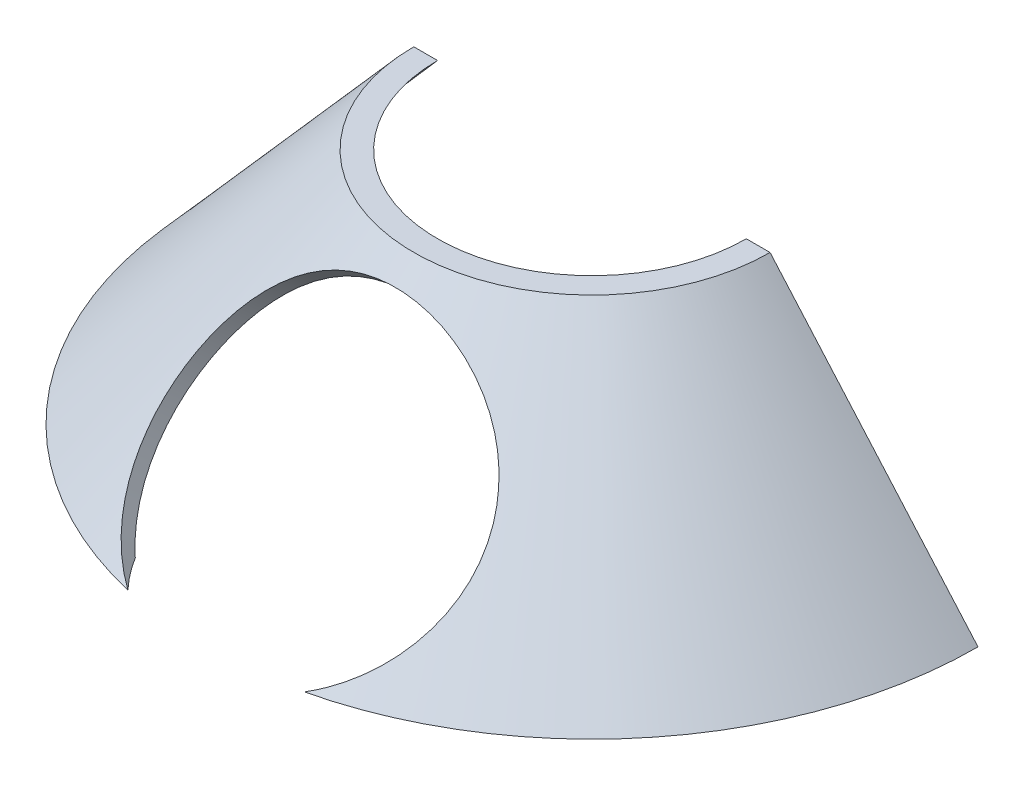
ISO-10303-21;
HEADER;
FILE_DESCRIPTION(('STEP AP214'),'2;1');
FILE_NAME('part.step','',(''),(''),'','','');
FILE_SCHEMA(('AUTOMOTIVE_DESIGN { 1 0 10303 214 1 1 1 1 }'));
ENDSEC;
DATA;
#1=APPLICATION_CONTEXT('core data for automotive mechanical design processes');
#2=APPLICATION_PROTOCOL_DEFINITION('international standard','automotive_design',2000,#1);
#3=PRODUCT_CONTEXT('',#1,'mechanical');
#4=PRODUCT('Part','Part','',(#3));
#5=PRODUCT_RELATED_PRODUCT_CATEGORY('part','',(#4));
#6=PRODUCT_DEFINITION_FORMATION('','',#4);
#7=PRODUCT_DEFINITION_CONTEXT('part definition',#1,'design');
#8=PRODUCT_DEFINITION('design','',#6,#7);
#9=PRODUCT_DEFINITION_SHAPE('','',#8);
#10=(LENGTH_UNIT() NAMED_UNIT(*) SI_UNIT(.MILLI.,.METRE.));
#11=(NAMED_UNIT(*) PLANE_ANGLE_UNIT() SI_UNIT($,.RADIAN.));
#12=(NAMED_UNIT(*) SI_UNIT($,.STERADIAN.) SOLID_ANGLE_UNIT());
#13=UNCERTAINTY_MEASURE_WITH_UNIT(LENGTH_MEASURE(1.E-05),#10,'distance_accuracy_value','');
#14=(GEOMETRIC_REPRESENTATION_CONTEXT(3) GLOBAL_UNCERTAINTY_ASSIGNED_CONTEXT((#13)) GLOBAL_UNIT_ASSIGNED_CONTEXT((#10,
#11,#12)) REPRESENTATION_CONTEXT('',''));
#15=CARTESIAN_POINT('',(0.,0.,0.));
#16=DIRECTION('',(0.,0.,1.));
#17=DIRECTION('',(1.,0.,0.));
#18=AXIS2_PLACEMENT_3D('',#15,#16,#17);
#19=CARTESIAN_POINT('',(0.,0.,0.));
#20=DIRECTION('',(0.,-1.,0.));
#21=DIRECTION('',(0.,0.,-1.));
#22=AXIS2_PLACEMENT_3D('',#19,#20,#21);
#23=CONICAL_SURFACE('',#22,61.,1.56686325052021);
#24=CARTESIAN_POINT('',(0.,0.,0.));
#25=DIRECTION('',(0.,1.,0.));
#26=DIRECTION('',(0.,0.,1.));
#27=AXIS2_PLACEMENT_3D('',#24,#25,#26);
#28=CIRCLE('',#27,61.);
#29=CARTESIAN_POINT('',(-61.,0.,-4.25960723338862E-13));
#30=VERTEX_POINT('',#29);
#31=CARTESIAN_POINT('',(-18.9174252185517,0.,57.9925083359955));
#32=VERTEX_POINT('',#31);
#33=EDGE_CURVE('E107',#30,#32,#28,.T.);
#34=ORIENTED_EDGE('',*,*,#33,.T.);
#35=CARTESIAN_POINT('',(-18.9591475531656,0.000199999999999984,57.9253791230487));
#36=CARTESIAN_POINT('',(-18.6573705996035,-0.00124988103156509,58.4120222954722));
#37=CARTESIAN_POINT('',(-18.3444733419885,-0.00267927306509809,58.8918684933251));
#38=CARTESIAN_POINT('',(-17.6966520932508,-0.0054869656496228,59.8345496521616));
#39=CARTESIAN_POINT('',(-17.3617891924924,-0.0068653925135811,60.2974266418628));
#40=CARTESIAN_POINT('',(-16.6686143897089,-0.00956897490145988,61.2054152312749));
#41=CARTESIAN_POINT('',(-16.3103004454762,-0.0108941257696362,61.6505252783235));
#42=CARTESIAN_POINT('',(-15.5687131493645,-0.0134867473782189,62.5214784630062));
#43=CARTESIAN_POINT('',(-15.1853754886874,-0.0147540540430336,62.9472667766919));
#44=CARTESIAN_POINT('',(-14.7897156052016,-0.0159867155627544,63.3614614735589));
#45=B_SPLINE_CURVE_WITH_KNOTS('',3,(#35,#36,#37,#38,#39,#40,#41,#42,#43,#44),.UNSPECIFIED.,.F.,
.F.,(4,2,2,2,4),(0.,1.71783064469967,3.43107117516295,5.14446110026493,6.86244225142476),.UNSPECIFIED.);
#46=CARTESIAN_POINT('',(-14.8537119946518,-0.0157867155627514,63.2942585838918));
#47=VERTEX_POINT('',#46);
#48=EDGE_CURVE('E54',#32,#47,#45,.T.);
#49=ORIENTED_EDGE('',*,*,#48,.T.);
#50=CARTESIAN_POINT('',(0.,-0.0157867155627517,0.));
#51=DIRECTION('',(0.,1.,0.));
#52=DIRECTION('',(0.,0.,1.));
#53=AXIS2_PLACEMENT_3D('',#50,#51,#52);
#54=CIRCLE('',#53,65.0138133761174);
#55=CARTESIAN_POINT('',(-65.0138133761174,-0.0157867155627544,-4.53989032339488E-13));
#56=VERTEX_POINT('',#55);
#57=EDGE_CURVE('E114',#56,#47,#54,.T.);
#58=ORIENTED_EDGE('',*,*,#57,.F.);
#59=DIRECTION('',(-0.999992265465479,-0.00393306613451181,0.));
#60=VECTOR('',#59,1.);
#61=CARTESIAN_POINT('',(-65.0138133761174,-0.0157867155627544,-4.53989032339488E-13));
#62=LINE('',#61,#60);
#63=EDGE_CURVE('E144',#30,#56,#62,.T.);
#64=ORIENTED_EDGE('',*,*,#63,.F.);
#65=EDGE_LOOP('',(#34,#49,#58,#64));
#66=FACE_BOUND('',#65,.T.);
#67=ADVANCED_FACE('F33',(#66),#23,.F.);
#68=CARTESIAN_POINT('',(-26.,40.,-1.81557029619843E-13));
#69=DIRECTION('',(0.,-1.,0.));
#70=DIRECTION('',(0.,0.,-1.));
#71=AXIS2_PLACEMENT_3D('',#68,#69,#70);
#72=PLANE('',#71);
#73=CARTESIAN_POINT('',(0.,40.,0.));
#74=DIRECTION('',(0.,1.,0.));
#75=DIRECTION('',(0.,0.,1.));
#76=AXIS2_PLACEMENT_3D('',#73,#74,#75);
#77=CIRCLE('',#76,30.);
#78=CARTESIAN_POINT('',(-30.,40.,-2.09488880330588E-13));
#79=VERTEX_POINT('',#78);
#80=CARTESIAN_POINT('',(30.,40.,0.));
#81=VERTEX_POINT('',#80);
#82=EDGE_CURVE('E47',#79,#81,#77,.T.);
#83=ORIENTED_EDGE('',*,*,#82,.T.);
#84=DIRECTION('',(-1.,0.,0.));
#85=VECTOR('',#84,1.);
#86=CARTESIAN_POINT('',(26.,40.,0.));
#87=LINE('',#86,#85);
#88=CARTESIAN_POINT('',(26.,40.,0.));
#89=VERTEX_POINT('',#88);
#90=EDGE_CURVE('E121',#81,#89,#87,.T.);
#91=ORIENTED_EDGE('',*,*,#90,.T.);
#92=CARTESIAN_POINT('',(0.,40.,0.));
#93=DIRECTION('',(0.,1.,0.));
#94=DIRECTION('',(0.,0.,1.));
#95=AXIS2_PLACEMENT_3D('',#92,#93,#94);
#96=CIRCLE('',#95,26.);
#97=CARTESIAN_POINT('',(-26.,40.,-1.81557029619843E-13));
#98=VERTEX_POINT('',#97);
#99=EDGE_CURVE('E108',#98,#89,#96,.T.);
#100=ORIENTED_EDGE('',*,*,#99,.F.);
#101=DIRECTION('',(1.,0.,0.));
#102=VECTOR('',#101,1.);
#103=CARTESIAN_POINT('',(-26.,40.,-1.81557029619843E-13));
#104=LINE('',#103,#102);
#105=EDGE_CURVE('E123',#79,#98,#104,.T.);
#106=ORIENTED_EDGE('',*,*,#105,.F.);
#107=EDGE_LOOP('',(#83,#91,#100,#106));
#108=FACE_BOUND('',#107,.T.);
#109=ADVANCED_FACE('F119',(#108),#72,.F.);
#110=CARTESIAN_POINT('',(0.,-0.0157867155627517,0.));
#111=DIRECTION('',(0.,-1.,0.));
#112=DIRECTION('',(0.,0.,-1.));
#113=AXIS2_PLACEMENT_3D('',#110,#111,#112);
#114=CONICAL_SURFACE('',#113,65.0138133761174,0.718829999621624);
#115=ORIENTED_EDGE('',*,*,#57,.T.);
#116=CARTESIAN_POINT('',(-14.8532154599646,-0.015986715562757,63.2945548611395));
#117=CARTESIAN_POINT('',(-15.1579685071026,0.10676310317448,63.1127170735655));
#118=CARTESIAN_POINT('',(-15.4579816189792,0.233482535696832,62.925708358728));
#119=CARTESIAN_POINT('',(-16.0480934782098,0.494755279759823,62.5418139851242));
#120=CARTESIAN_POINT('',(-16.3381926636224,0.629308244454393,62.3449287637144));
#121=CARTESIAN_POINT('',(-17.1928030590795,1.04447693912865,61.7402754344884));
#122=CARTESIAN_POINT('',(-17.7418463517279,1.33669068029028,61.3183785465776));
#123=CARTESIAN_POINT('',(-18.794649115286,1.9507724414093,60.4414714245331));
#124=CARTESIAN_POINT('',(-19.298424791873,2.27262976481589,59.9864731470159));
#125=CARTESIAN_POINT('',(-20.0177740156506,2.77682801863679,59.2825366578842));
#126=CARTESIAN_POINT('',(-20.2515170872217,2.94847328555975,59.0443036875594));
#127=CARTESIAN_POINT('',(-20.7066318004697,3.29884424046857,58.5611675392715));
#128=CARTESIAN_POINT('',(-20.9280002227789,3.47757175048264,58.3162626499742));
#129=CARTESIAN_POINT('',(-21.5728303618531,4.02406374138604,57.5725827743319));
#130=CARTESIAN_POINT('',(-21.97716922609,4.40224424579851,57.0646932926129));
#131=CARTESIAN_POINT('',(-22.731909210599,5.18517013508192,56.0296772410567));
#132=CARTESIAN_POINT('',(-23.0823109480215,5.58991521592445,55.5025508914137));
#133=CARTESIAN_POINT('',(-23.5655709153678,6.21603253771426,54.7013457623459));
#134=CARTESIAN_POINT('',(-23.7196212841616,6.42793962281637,54.4324818310469));
#135=CARTESIAN_POINT('',(-24.0132996548077,6.85790530003063,53.8919467220521));
#136=CARTESIAN_POINT('',(-24.1529312875998,7.07596232576352,53.620276270146));
#137=CARTESIAN_POINT('',(-24.5498500175142,7.7392505795381,52.8019016018062));
#138=CARTESIAN_POINT('',(-24.7851952127674,8.19364328513533,52.2517771839021));
#139=CARTESIAN_POINT('',(-25.1947476635358,9.12425654762029,51.1493902544578));
#140=CARTESIAN_POINT('',(-25.3690765923774,9.60043149812457,50.597134244041));
#141=CARTESIAN_POINT('',(-25.6555764915661,10.5738871216369,49.4950186173892));
#142=CARTESIAN_POINT('',(-25.7677471076979,11.0711679149014,48.9451590148282));
#143=CARTESIAN_POINT('',(-25.9285469976595,12.0846761155405,47.8539190322583));
#144=CARTESIAN_POINT('',(-25.9771935030561,12.6008983457772,47.3125363921719));
#145=CARTESIAN_POINT('',(-26.0101443780919,13.6499634373794,46.2440975851717));
#146=CARTESIAN_POINT('',(-25.9944524472589,14.1828053413479,45.7170405962721));
#147=CARTESIAN_POINT('',(-25.9009611838743,15.2344884217201,44.7096491977319));
#148=CARTESIAN_POINT('',(-25.8263832664443,15.7526493799124,44.2283042836328));
#149=CARTESIAN_POINT('',(-25.6195179032562,16.7982503597174,43.2886426996241));
#150=CARTESIAN_POINT('',(-25.4872326324747,17.3256900308986,42.830325162544));
#151=CARTESIAN_POINT('',(-25.1660728932463,18.3861889734555,41.9412564746031));
#152=CARTESIAN_POINT('',(-24.9772194319603,18.9192460879602,41.5104951624047));
#153=CARTESIAN_POINT('',(-24.5446234777557,19.9872938037139,40.6800775408366));
#154=CARTESIAN_POINT('',(-24.3008823123115,20.5222843578944,40.2804204795165));
#155=CARTESIAN_POINT('',(-23.7736026033694,21.5647513719965,39.5331689881191));
#156=CARTESIAN_POINT('',(-23.4924879571412,22.0723337283021,39.1840070165426));
#157=CARTESIAN_POINT('',(-22.8849568438256,23.0816022855491,38.5181685742124));
#158=CARTESIAN_POINT('',(-22.558542117097,23.5832887122003,38.2014908562763));
#159=CARTESIAN_POINT('',(-21.8630193682785,24.5769113363981,37.6013700182165));
#160=CARTESIAN_POINT('',(-21.4939063953234,25.0688463955111,37.3179307597832));
#161=CARTESIAN_POINT('',(-20.7157636227441,26.0389586126618,36.7842725678212));
#162=CARTESIAN_POINT('',(-20.3067321021714,26.5171351763986,36.534055067631));
#163=CARTESIAN_POINT('',(-19.4354027743089,27.4733862883176,36.0572529058389));
#164=CARTESIAN_POINT('',(-18.971680827524,27.9507816151113,35.8319098314596));
#165=CARTESIAN_POINT('',(-18.0070988534009,28.8819947114036,35.4145271498302));
#166=CARTESIAN_POINT('',(-17.5062381079777,29.3358120247284,35.2224881867606));
#167=CARTESIAN_POINT('',(-16.4696262942751,30.2157035496362,34.8693824892466));
#168=CARTESIAN_POINT('',(-15.9338460481385,30.641753949739,34.7083421123294));
#169=CARTESIAN_POINT('',(-14.8302733477568,31.4610181332001,34.4148509573888));
#170=CARTESIAN_POINT('',(-14.2624790732665,31.8542300462762,34.2824018070695));
#171=CARTESIAN_POINT('',(-13.046567187154,32.6355291077203,34.0328796399169));
#172=CARTESIAN_POINT('',(-12.395759858474,33.0201910849161,33.9181484714958));
#173=CARTESIAN_POINT('',(-11.0624256309834,33.7383828874174,33.7154556310974));
#174=CARTESIAN_POINT('',(-10.3798966177638,34.0719092978938,33.6274957465184));
#175=CARTESIAN_POINT('',(-8.98747487772462,34.6808191947427,33.4748205166387));
#176=CARTESIAN_POINT('',(-8.27760560340763,34.9562512563284,33.4100857198248));
#177=CARTESIAN_POINT('',(-6.83462152437908,35.4427249855538,33.3005066624506));
#178=CARTESIAN_POINT('',(-6.10150942008595,35.6537741033436,33.2556601002264));
#179=CARTESIAN_POINT('',(-4.65649658750473,35.9964823504094,33.1850490890502));
#180=CARTESIAN_POINT('',(-3.94548712402042,36.1317114797076,33.1584105230887));
#181=CARTESIAN_POINT('',(-2.51354657284196,36.3353432315145,33.1189289856361));
#182=CARTESIAN_POINT('',(-1.79261591752302,36.4037487569667,33.1060854148618));
#183=CARTESIAN_POINT('',(-0.347839334004111,36.4716645440124,33.0933328439535));
#184=CARTESIAN_POINT('',(0.376004520684461,36.4712172940488,33.0934158669324));
#185=CARTESIAN_POINT('',(1.82021565566057,36.4015399131865,33.1065011639985));
#186=CARTESIAN_POINT('',(2.54058316759315,36.3323144307179,33.1195025649872));
#187=CARTESIAN_POINT('',(3.88571800783059,36.1394633328537,33.1569198641945));
#188=CARTESIAN_POINT('',(4.51162076116688,36.0233287290841,33.1797857313424));
#189=CARTESIAN_POINT('',(5.75164571601035,35.7419285970782,33.2373139405474));
#190=CARTESIAN_POINT('',(6.36576903202391,35.5766677415543,33.2719751607184));
#191=CARTESIAN_POINT('',(7.57908440833704,35.2001882610537,33.3545971181949));
#192=CARTESIAN_POINT('',(8.17826988563965,34.9889497595792,33.4025636099427));
#193=CARTESIAN_POINT('',(9.35859414289155,34.5242490928775,33.5135824042052));
#194=CARTESIAN_POINT('',(9.93973156295513,34.2707837550544,33.5766358403908));
#195=CARTESIAN_POINT('',(11.1206367931426,33.7068344923981,33.7247305120732));
#196=CARTESIAN_POINT('',(11.7189554988516,33.3936346861735,33.8109817086268));
#197=CARTESIAN_POINT('',(12.8897332406868,32.7281749701439,34.0055722451155));
#198=CARTESIAN_POINT('',(13.4621901942928,32.3759119226297,34.1139133599844));
#199=CARTESIAN_POINT('',(14.5792139716586,31.6367464707928,34.3553535650298));
#200=CARTESIAN_POINT('',(15.1237675401248,31.2498278390756,34.4884642852817));
#201=CARTESIAN_POINT('',(16.1824940968477,30.4458861316027,34.7819355135829));
#202=CARTESIAN_POINT('',(16.6966651876612,30.0288611792561,34.9422977211202));
#203=CARTESIAN_POINT('',(17.7528485858356,29.1166583069496,35.3138834661068));
#204=CARTESIAN_POINT('',(18.2906511215616,28.6181415432385,35.5289196122581));
#205=CARTESIAN_POINT('',(19.3216355928692,27.5943672793918,35.9988885335374));
#206=CARTESIAN_POINT('',(19.8148141528998,27.0691077610068,36.2538243228724));
#207=CARTESIAN_POINT('',(20.7525673051661,25.9977941136,36.8053362405529));
#208=CARTESIAN_POINT('',(21.1971594908016,25.4517476088824,37.101897206733));
#209=CARTESIAN_POINT('',(22.0339588848799,24.3444231326157,37.7374653752537));
#210=CARTESIAN_POINT('',(22.4261701281173,23.783146338236,38.0764693043996));
#211=CARTESIAN_POINT('',(23.1402532880423,22.6728923404528,38.7824679932684));
#212=CARTESIAN_POINT('',(23.4642570755319,22.1242775457581,39.147875646602));
#213=CARTESIAN_POINT('',(24.0570586312249,21.0231211520258,39.9157309754014));
#214=CARTESIAN_POINT('',(24.3258572390279,20.4705796128412,40.3181780874099));
#215=CARTESIAN_POINT('',(24.805447262864,19.3664547292669,41.1571451210845));
#216=CARTESIAN_POINT('',(25.0162548613116,18.8148711603342,41.5936554936502));
#217=CARTESIAN_POINT('',(25.3778720278802,17.7169000739678,42.4969766398964));
#218=CARTESIAN_POINT('',(25.52868451894,17.170512304663,42.9637859361357));
#219=CARTESIAN_POINT('',(25.760046518285,16.1271744025824,43.8873420446074));
#220=CARTESIAN_POINT('',(25.8449858180079,15.6295685841446,44.3422572383757));
#221=CARTESIAN_POINT('',(25.9618381465852,14.6449055196428,45.2699013418107));
#222=CARTESIAN_POINT('',(25.993754241043,14.1578476653422,45.7426292199984));
#223=CARTESIAN_POINT('',(26.0045849406989,13.1965907171059,46.7015626475531));
#224=CARTESIAN_POINT('',(25.9834981808202,12.7223919546713,47.1877685437245));
#225=CARTESIAN_POINT('',(25.8887889602444,11.7888189140444,48.1692051884277));
#226=CARTESIAN_POINT('',(25.8151647825468,11.3294451208667,48.6644362313992));
#227=CARTESIAN_POINT('',(25.6143019418059,10.4185240738244,49.6690160634497));
#228=CARTESIAN_POINT('',(25.4860631616062,9.96729536080902,50.1784535568364));
#229=CARTESIAN_POINT('',(25.1770848031535,9.0834124927508,51.1974670400948));
#230=CARTESIAN_POINT('',(24.9963447371044,8.65075851033102,51.7070430312094));
#231=CARTESIAN_POINT('',(24.5836817609836,7.80500575560516,52.7221667855994));
#232=CARTESIAN_POINT('',(24.351736977511,7.39191543228279,53.2277127314251));
#233=CARTESIAN_POINT('',(23.9667994124115,6.78802488810557,53.9794488657354));
#234=CARTESIAN_POINT('',(23.8323102841399,6.58934403893207,54.228940972671));
#235=CARTESIAN_POINT('',(23.5511632066221,6.19726345767668,54.7253195164623));
#236=CARTESIAN_POINT('',(23.404502354331,6.00386500018716,54.9722053157761));
#237=CARTESIAN_POINT('',(22.9283124591464,5.40894293841837,55.7375521581129));
#238=CARTESIAN_POINT('',(22.5779093341096,5.01686706927596,56.2505478544609));
#239=CARTESIAN_POINT('',(21.8258615414307,4.25824875801122,57.2575192400368));
#240=CARTESIAN_POINT('',(21.4242153328997,3.89170708421942,57.7514943567307));
#241=CARTESIAN_POINT('',(20.7854880836634,3.36197762722478,58.4745406098599));
#242=CARTESIAN_POINT('',(20.5665894294042,3.18878509061482,58.7125183384149));
#243=CARTESIAN_POINT('',(20.1170465328646,2.84918876282381,59.1819904482933));
#244=CARTESIAN_POINT('',(19.8864052497519,2.68278328014248,59.4134864404592));
#245=CARTESIAN_POINT('',(19.1774292973066,2.19395656561894,60.0974096561126));
#246=CARTESIAN_POINT('',(18.6818537093061,1.88176875888359,60.5394861269535));
#247=CARTESIAN_POINT('',(17.6523279757756,1.28837460490026,61.3880089002894));
#248=CARTESIAN_POINT('',(17.1187354674801,1.00692986330963,61.7947234983972));
#249=CARTESIAN_POINT('',(16.0136935892553,0.473401696388469,62.5722515679605));
#250=CARTESIAN_POINT('',(15.4423078130024,0.221270822864874,62.94312288731));
#251=CARTESIAN_POINT('',(14.8532154599646,-0.0159867155627539,63.2945548611395));
#252=B_SPLINE_CURVE_WITH_KNOTS('',3,(#116,#117,#118,#119,#120,#121,#122,#123,#124,#125,#126,
#127,#128,#129,#130,#131,#132,#133,#134,#135,#136,#137,#138,#139,#140,#141,#142,#143,#144,#145,
#146,#147,#148,#149,#150,#151,#152,#153,#154,#155,#156,#157,#158,#159,#160,#161,#162,#163,#164,
#165,#166,#167,#168,#169,#170,#171,#172,#173,#174,#175,#176,#177,#178,#179,#180,#181,#182,#183,
#184,#185,#186,#187,#188,#189,#190,#191,#192,#193,#194,#195,#196,#197,#198,#199,#200,#201,#202,
#203,#204,#205,#206,#207,#208,#209,#210,#211,#212,#213,#214,#215,#216,#217,#218,#219,#220,#221,
#222,#223,#224,#225,#226,#227,#228,#229,#230,#231,#232,#233,#234,#235,#236,#237,#238,#239,#240,
#241,#242,#243,#244,#245,#246,#247,#248,#249,#250,#251),.UNSPECIFIED.,.F.,.F.,(4,2,2,2,2,2,2,2,
2,2,2,2,2,2,2,2,2,2,2,2,2,2,2,2,2,2,2,2,2,2,2,2,2,2,2,2,2,2,2,2,2,2,2,2,2,2,2,2,2,2,2,2,2,2,2,2,
2,2,2,2,2,2,2,2,2,2,2,4),(0.,1.12635178535043,2.25265373698569,4.50444955170418,
6.75543599121405,7.88105848618295,9.00697247121818,11.2580875660224,13.5091769015753,
14.6350744709884,15.7606878208225,18.0116758067489,20.2581491463122,22.5046352874956,
24.750511919592,26.9962594132329,29.1270112166749,31.2576827195162,33.387563955184,
35.5173936846094,37.5466125609639,39.5757534994423,41.6051299532623,43.6345939352291,
45.7403296630874,47.8461061163303,49.9536652390521,52.0613443139018,54.3524801668481,
56.6437689550857,58.9331342348512,61.2222344973681,63.3918070985569,65.5612854452195,
67.7294250312198,69.8974180917957,71.8062859108237,73.7149722232731,75.624485320525,
77.5341419484798,79.5745613224131,81.615144709531,83.6566886406502,85.6983599355814,
87.9881396459946,90.2780924207215,92.5672132237302,94.8561575987149,97.0566828883724,
99.2571747084033,101.45705185598,103.656821813253,105.69306561636,107.729191687375,
109.765370198903,111.801615258799,113.876870423008,115.952144869287,118.028307543288,
119.066477657584,120.104896098568,122.306107284813,124.507384677487,125.607527579296,
126.707394601896,128.906155420692,131.086431435616,133.263127764479),.UNSPECIFIED.);
#253=CARTESIAN_POINT('',(14.8537119946518,-0.0157867155627514,63.2942585838918));
#254=VERTEX_POINT('',#253);
#255=EDGE_CURVE('E130',#47,#254,#252,.T.);
#256=ORIENTED_EDGE('',*,*,#255,.T.);
#257=CARTESIAN_POINT('',(65.0138133761174,-0.0157867155627544,0.));
#258=VERTEX_POINT('',#257);
#259=EDGE_CURVE('E101',#254,#258,#54,.T.);
#260=ORIENTED_EDGE('',*,*,#259,.T.);
#261=DIRECTION('',(-0.658504607868518,0.752576694706878,0.));
#262=VECTOR('',#261,1.);
#263=CARTESIAN_POINT('',(30.,40.,0.));
#264=LINE('',#263,#262);
#265=EDGE_CURVE('E125',#258,#81,#264,.T.);
#266=ORIENTED_EDGE('',*,*,#265,.T.);
#267=ORIENTED_EDGE('',*,*,#82,.F.);
#268=DIRECTION('',(0.658504607868518,0.752576694706878,0.));
#269=VECTOR('',#268,1.);
#270=CARTESIAN_POINT('',(-30.,40.,-2.09488880330588E-13));
#271=LINE('',#270,#269);
#272=EDGE_CURVE('E110',#56,#79,#271,.T.);
#273=ORIENTED_EDGE('',*,*,#272,.F.);
#274=EDGE_LOOP('',(#115,#256,#260,#266,#267,#273));
#275=FACE_BOUND('',#274,.T.);
#276=ADVANCED_FACE('F35',(#275),#114,.T.);
#277=ORIENTED_EDGE('',*,*,#259,.F.);
#278=CARTESIAN_POINT('',(14.7897156052016,-0.0159867155627544,63.3614614735589));
#279=CARTESIAN_POINT('',(15.1853754886874,-0.0147540540430336,62.9472667766919));
#280=CARTESIAN_POINT('',(15.5687131493645,-0.0134867473782189,62.5214784630062));
#281=CARTESIAN_POINT('',(16.3103004454762,-0.0108941257696362,61.6505252783235));
#282=CARTESIAN_POINT('',(16.6686143897089,-0.00956897490145994,61.2054152312749));
#283=CARTESIAN_POINT('',(17.3617891924924,-0.00686539251358113,60.2974266418628));
#284=CARTESIAN_POINT('',(17.6966520932508,-0.00548696564962281,59.8345496521616));
#285=CARTESIAN_POINT('',(18.3444733419885,-0.00267927306509807,58.8918684933251));
#286=CARTESIAN_POINT('',(18.6573705996035,-0.00124988103156508,58.4120222954722));
#287=CARTESIAN_POINT('',(18.9591475531656,0.000199999999999989,57.9253791230487));
#288=B_SPLINE_CURVE_WITH_KNOTS('',3,(#278,#279,#280,#281,#282,#283,#284,#285,#286,#287),
.UNSPECIFIED.,.F.,.F.,(4,2,2,2,4),(0.,1.71798115115982,3.43137107626181,5.14461160672511,
6.86244225142478),.UNSPECIFIED.);
#289=CARTESIAN_POINT('',(18.9174252185517,0.,57.9925083359955));
#290=VERTEX_POINT('',#289);
#291=EDGE_CURVE('E91',#254,#290,#288,.T.);
#292=ORIENTED_EDGE('',*,*,#291,.T.);
#293=CARTESIAN_POINT('',(61.,0.,0.));
#294=VERTEX_POINT('',#293);
#295=EDGE_CURVE('E99',#290,#294,#28,.T.);
#296=ORIENTED_EDGE('',*,*,#295,.T.);
#297=DIRECTION('',(0.999992265465479,-0.00393306613451181,0.));
#298=VECTOR('',#297,1.);
#299=CARTESIAN_POINT('',(65.0138133761174,-0.0157867155627544,0.));
#300=LINE('',#299,#298);
#301=EDGE_CURVE('E127',#294,#258,#300,.T.);
#302=ORIENTED_EDGE('',*,*,#301,.T.);
#303=EDGE_LOOP('',(#277,#292,#296,#302));
#304=FACE_BOUND('',#303,.T.);
#305=ADVANCED_FACE('F97',(#304),#23,.F.);
#306=CARTESIAN_POINT('',(0.,40.,0.));
#307=DIRECTION('',(0.,-1.,0.));
#308=DIRECTION('',(0.,0.,-1.));
#309=AXIS2_PLACEMENT_3D('',#306,#307,#308);
#310=CONICAL_SURFACE('',#309,26.,0.718829999621625);
#311=ORIENTED_EDGE('',*,*,#295,.F.);
#312=CARTESIAN_POINT('',(18.9171039467399,-0.000199999999999332,57.9927972105059));
#313=CARTESIAN_POINT('',(19.4233630396189,0.31493514661771,57.5376637568325));
#314=CARTESIAN_POINT('',(19.9063596587714,0.644473530962478,57.0667431103277));
#315=CARTESIAN_POINT('',(20.823026365704,1.33141426008144,56.097978301811));
#316=CARTESIAN_POINT('',(21.2566963207903,1.68881667980838,55.6001340673771));
#317=CARTESIAN_POINT('',(22.0724305482567,2.43101910423644,54.5815196469729));
#318=CARTESIAN_POINT('',(22.4544276082696,2.81585381657746,54.0607207480866));
#319=CARTESIAN_POINT('',(22.9861632980335,3.41242615165827,53.2667485758427));
#320=CARTESIAN_POINT('',(23.1565371307465,3.61451106906492,52.9999526313013));
#321=CARTESIAN_POINT('',(23.4833209709276,4.02508859223631,52.4626172702327));
#322=CARTESIAN_POINT('',(23.6397271105244,4.23358295152183,52.1920768406062));
#323=CARTESIAN_POINT('',(24.0876805403285,4.86870180653591,51.3755436134489));
#324=CARTESIAN_POINT('',(24.3577705711603,5.30474684152041,50.8249263757628));
#325=CARTESIAN_POINT('',(24.8383966190531,6.200602278541,49.7170709166359));
#326=CARTESIAN_POINT('',(25.0489351253511,6.66041168628252,49.1598329729536));
#327=CARTESIAN_POINT('',(25.3185784509038,7.36669437567837,48.3235700315658));
#328=CARTESIAN_POINT('',(25.4007567146375,7.60484679553221,48.0447894506913));
#329=CARTESIAN_POINT('',(25.5495447514823,8.08648379642918,47.4878135963486));
#330=CARTESIAN_POINT('',(25.6161584564251,8.32996701380134,47.2096181926916));
#331=CARTESIAN_POINT('',(25.7923828254121,9.06822730762788,46.3768873632885));
#332=CARTESIAN_POINT('',(25.8784041363218,9.5708865662936,45.8241223061827));
#333=CARTESIAN_POINT('',(25.9847163172722,10.5805460123058,44.7451392196697));
#334=CARTESIAN_POINT('',(26.0067771382845,11.0870321999002,44.2186110212265));
#335=CARTESIAN_POINT('',(25.9896180862786,12.1154207036076,43.1817798976497));
#336=CARTESIAN_POINT('',(25.9503991742942,12.6373227778314,42.6714767181916));
#337=CARTESIAN_POINT('',(25.8106780363594,13.6935302952206,41.6728897267308));
#338=CARTESIAN_POINT('',(25.7101957627674,14.2278316456932,41.1845988013195));
#339=CARTESIAN_POINT('',(25.4486592286953,15.3056270645696,40.2351502000502));
#340=CARTESIAN_POINT('',(25.2876085591226,15.849120586175,39.7739909175174));
#341=CARTESIAN_POINT('',(24.9189761721797,16.9054067460361,38.9128250840125));
#342=CARTESIAN_POINT('',(24.7151566703013,17.4178644526499,38.5107913161967));
#343=CARTESIAN_POINT('',(24.2577549412821,18.4438399275542,37.7376259801461));
#344=CARTESIAN_POINT('',(24.0041752741235,18.9573576399671,37.3664928235839));
#345=CARTESIAN_POINT('',(23.449579648536,19.9815762351902,36.6574928082084));
#346=CARTESIAN_POINT('',(23.1485701764779,20.4922774933011,36.3196214108582));
#347=CARTESIAN_POINT('',(22.501744652964,21.5069550289967,35.678474081658));
#348=CARTESIAN_POINT('',(22.1559276793089,22.0109311679337,35.3751988620861));
#349=CARTESIAN_POINT('',(21.4245689330452,23.0050646356205,34.8054127330171));
#350=CARTESIAN_POINT('',(21.0392786603727,23.4952868582369,34.5386916259098));
#351=CARTESIAN_POINT('',(20.2301210623257,24.4610080186571,34.0394158590849));
#352=CARTESIAN_POINT('',(19.8062541470401,24.936507112903,33.8068608362335));
#353=CARTESIAN_POINT('',(18.9224226582931,25.8690165256957,33.3745539260302));
#354=CARTESIAN_POINT('',(18.4624375956482,26.3260161237727,33.1748208595938));
#355=CARTESIAN_POINT('',(17.509102838785,27.2171779557974,32.8064375966219));
#356=CARTESIAN_POINT('',(17.0157510165074,27.6513387299895,32.637789385171));
#357=CARTESIAN_POINT('',(15.9513214813652,28.5312201497769,32.3150934791285));
#358=CARTESIAN_POINT('',(15.3772643692552,28.9743525701127,32.1638010937883));
#359=CARTESIAN_POINT('',(14.194877475759,29.8227743415684,31.891999983671));
#360=CARTESIAN_POINT('',(13.5865455955962,30.2280613712218,31.771493146518));
#361=CARTESIAN_POINT('',(12.3380044012233,30.9949661821472,31.5575065320906));
#362=CARTESIAN_POINT('',(11.6977821521773,31.3565660366838,31.4640378279423));
#363=CARTESIAN_POINT('',(10.3885957112352,32.0295810375525,31.3004459594916));
#364=CARTESIAN_POINT('',(9.71963147294807,32.34099610288,31.2303228328718));
#365=CARTESIAN_POINT('',(8.33411131742447,32.9163500708214,31.1078649479288));
#366=CARTESIAN_POINT('',(7.61671591732891,33.1784275589297,31.0561789157664));
#367=CARTESIAN_POINT('',(6.52418174408647,33.5209936493903,30.9918118131507));
#368=CARTESIAN_POINT('',(6.15719343404325,33.6267723535566,30.9725474021012));
#369=CARTESIAN_POINT('',(5.4184217255085,33.820715711882,30.9380320530365));
#370=CARTESIAN_POINT('',(5.04663900005737,33.9088828103126,30.9227805579853));
#371=CARTESIAN_POINT('',(4.29965534963353,34.0667772822051,30.8959820724431));
#372=CARTESIAN_POINT('',(3.92446067631436,34.1365332645577,30.8844293284685));
#373=CARTESIAN_POINT('',(3.1710110906581,34.2571958337252,30.8647313902336));
#374=CARTESIAN_POINT('',(2.79275660636619,34.3081050120178,30.856585727472));
#375=CARTESIAN_POINT('',(2.03411613368241,34.3906322277706,30.8435011275273));
#376=CARTESIAN_POINT('',(1.65373033222842,34.4222519311864,30.8385619134135));
#377=CARTESIAN_POINT('',(0.891850703634921,34.4659272416475,30.8317663880016));
#378=CARTESIAN_POINT('',(0.510356921527061,34.4779836329586,30.829909953119));
#379=CARTESIAN_POINT('',(-0.523590801304963,34.483958045111,30.8289782610047));
#380=CARTESIAN_POINT('',(-1.17625841762217,34.4589388252022,30.8328106064391));
#381=CARTESIAN_POINT('',(-2.47661799297041,34.3519515577536,30.8495919873351));
#382=CARTESIAN_POINT('',(-3.12431043573706,34.2699891195132,30.8625401248299));
#383=CARTESIAN_POINT('',(-4.41039465344612,34.0512074901778,30.8985020264717));
#384=CARTESIAN_POINT('',(-5.04878146617556,33.9143600663799,30.9215209715719));
#385=CARTESIAN_POINT('',(-6.31170441527153,33.5890723264501,30.9791270859125));
#386=CARTESIAN_POINT('',(-6.93623992609073,33.4006296853023,31.0137147764865));
#387=CARTESIAN_POINT('',(-8.15353466238935,32.9811457545625,31.0954399412848));
#388=CARTESIAN_POINT('',(-8.74669544790976,32.7512037657074,31.1422650022281));
#389=CARTESIAN_POINT('',(-9.91389051290725,32.2500060679984,31.2509259284467));
#390=CARTESIAN_POINT('',(-10.4879230994026,31.9787467140382,31.3127631184103));
#391=CARTESIAN_POINT('',(-11.6148586477103,31.3989642292851,31.4537718235191));
#392=CARTESIAN_POINT('',(-12.1677542940144,31.0904283480473,31.5329492774746));
#393=CARTESIAN_POINT('',(-13.2504006251166,30.4401885501059,31.7110213237776));
#394=CARTESIAN_POINT('',(-13.7801492463646,30.0984816849325,31.8099176697037));
#395=CARTESIAN_POINT('',(-14.8953272904924,29.3302734507343,32.0469456960001));
#396=CARTESIAN_POINT('',(-15.4765911419234,28.8988519495063,32.1887882557916));
#397=CARTESIAN_POINT('',(-16.6032438168621,28.0025220375376,32.5055369467066));
#398=CARTESIAN_POINT('',(-17.14862964582,27.5376108383554,32.6804458329946));
#399=CARTESIAN_POINT('',(-18.2007016465729,26.579632461704,33.0665001971361));
#400=CARTESIAN_POINT('',(-18.7073812061019,26.0865604985091,33.2776518464948));
#401=CARTESIAN_POINT('',(-19.6787051899982,25.0776081032955,33.738690757876));
#402=CARTESIAN_POINT('',(-20.1433501845985,24.5617279808294,33.9885774943008));
#403=CARTESIAN_POINT('',(-21.0428228351383,23.4936907745967,34.5383730982386));
#404=CARTESIAN_POINT('',(-21.4760050088715,22.9408960046838,34.8397435498281));
#405=CARTESIAN_POINT('',(-22.2894764447711,21.8221647196903,35.4864690521031));
#406=CARTESIAN_POINT('',(-22.6697639938076,21.2562277796588,35.8318255266966));
#407=CARTESIAN_POINT('',(-23.3732125224555,20.1172998031715,36.5654751852252));
#408=CARTESIAN_POINT('',(-23.6964084761007,19.5443133169886,36.9537418439199));
#409=CARTESIAN_POINT('',(-24.282315303424,18.3965312881853,37.7710520076091));
#410=CARTESIAN_POINT('',(-24.5450323084758,17.8217359349427,38.2000913728185));
#411=CARTESIAN_POINT('',(-24.9849664036926,16.7303451245179,39.0524074199944));
#412=CARTESIAN_POINT('',(-25.1679543143239,16.2134362275138,39.4723179884083));
#413=CARTESIAN_POINT('',(-25.480481596323,15.1859127269981,40.338829480401));
#414=CARTESIAN_POINT('',(-25.6100244913482,14.6752977106817,40.7854286421638));
#415=CARTESIAN_POINT('',(-25.8146903423696,13.6634830934547,41.7011284578542));
#416=CARTESIAN_POINT('',(-25.8898148743785,13.1622832202812,42.1702284597145));
#417=CARTESIAN_POINT('',(-25.985284205219,12.171950530899,43.1263789176158));
#418=CARTESIAN_POINT('',(-26.0056283674949,11.6828178549782,43.6134295821793));
#419=CARTESIAN_POINT('',(-25.9918616260518,10.7294381468847,44.5898861647593));
#420=CARTESIAN_POINT('',(-25.9589337523139,10.2648806977431,45.0790068104802));
#421=CARTESIAN_POINT('',(-25.8414333326582,9.35121658725272,46.065334855241));
#422=CARTESIAN_POINT('',(-25.7568617398942,8.90210964090592,46.562542104867));
#423=CARTESIAN_POINT('',(-25.5369210521599,8.02050651741661,47.5609146354946));
#424=CARTESIAN_POINT('',(-25.4015289475497,7.58801796238982,48.0620816085405));
#425=CARTESIAN_POINT('',(-25.1612977885094,6.95293079059928,48.813229267586));
#426=CARTESIAN_POINT('',(-25.0750254759247,6.74350014675532,49.0635227014682));
#427=CARTESIAN_POINT('',(-24.8902388676541,6.32922630926993,49.563490059905));
#428=CARTESIAN_POINT('',(-24.7917217858673,6.12438417222913,49.8131638302356));
#429=CARTESIAN_POINT('',(-24.4655219507206,5.49266860940886,50.5903263475377));
#430=CARTESIAN_POINT('',(-24.2167396641247,5.07403838243256,51.1158195611001));
#431=CARTESIAN_POINT('',(-23.6668036388334,4.2592025052081,52.1566960203832));
#432=CARTESIAN_POINT('',(-23.3656476631985,3.86299781373833,52.6720788332306));
#433=CARTESIAN_POINT('',(-22.87638529285,3.28644694409834,53.4338366374431));
#434=CARTESIAN_POINT('',(-22.707107978054,3.09728489494526,53.6857848491009));
#435=CARTESIAN_POINT('',(-22.3563117518796,2.72494289157454,54.1854160509754));
#436=CARTESIAN_POINT('',(-22.1747956965297,2.54176155640705,54.4331000194748));
#437=CARTESIAN_POINT('',(-21.6123449245532,2.00139842387314,55.1688822901622));
#438=CARTESIAN_POINT('',(-21.2133395402415,1.65319987537155,55.6499728799891));
#439=CARTESIAN_POINT('',(-20.5001086499719,1.08561443741979,56.4438453389185));
#440=CARTESIAN_POINT('',(-20.1977615664733,0.859659334322554,56.7627171518996));
#441=CARTESIAN_POINT('',(-19.5726400966714,0.420349137606033,57.3875686980839));
#442=CARTESIAN_POINT('',(-19.2499009561804,0.206973472518094,57.6935692311146));
#443=CARTESIAN_POINT('',(-18.9171039467399,-0.000199999999991071,57.9927972105059));
#444=B_SPLINE_CURVE_WITH_KNOTS('',3,(#312,#313,#314,#315,#316,#317,#318,#319,#320,#321,#322,
#323,#324,#325,#326,#327,#328,#329,#330,#331,#332,#333,#334,#335,#336,#337,#338,#339,#340,#341,
#342,#343,#344,#345,#346,#347,#348,#349,#350,#351,#352,#353,#354,#355,#356,#357,#358,#359,#360,
#361,#362,#363,#364,#365,#366,#367,#368,#369,#370,#371,#372,#373,#374,#375,#376,#377,#378,#379,
#380,#381,#382,#383,#384,#385,#386,#387,#388,#389,#390,#391,#392,#393,#394,#395,#396,#397,#398,
#399,#400,#401,#402,#403,#404,#405,#406,#407,#408,#409,#410,#411,#412,#413,#414,#415,#416,#417,
#418,#419,#420,#421,#422,#423,#424,#425,#426,#427,#428,#429,#430,#431,#432,#433,#434,#435,#436,
#437,#438,#439,#440,#441,#442,#443),.UNSPECIFIED.,.F.,.F.,(4,2,2,2,2,2,2,2,2,2,2,2,2,2,2,2,2,2,
2,2,2,2,2,2,2,2,2,2,2,2,2,2,2,2,2,2,2,2,2,2,2,2,2,2,2,2,2,2,2,2,2,2,2,2,2,2,2,2,2,2,2,2,2,2,2,
4),(0.,2.24972644076454,4.49945893337978,6.75209014026249,7.87848477312762,9.00519036118486,
11.2598196650939,13.5143547122026,14.641287789397,15.7679358785361,18.0208899454646,
20.210874493082,22.4008246961022,24.5900620530303,26.7791696375016,28.8241311298278,
30.8689874437807,32.913564351085,34.9581833452501,36.9905019278949,39.0227989085096,
41.0562572219837,43.0898453475214,45.3098374571339,47.5299656534991,49.7510017922783,
51.9720415160564,54.2649206345409,55.4117886415654,56.5584973668374,57.7034135976063,
58.8481723413053,59.9928322027221,61.1374461751912,63.094131190869,65.0506234869077,
67.0081234912668,68.9657117202324,70.8775187048514,72.7894944509696,74.7021260502959,
76.6149278136823,78.8254240616897,81.0361045747112,83.2471619018768,85.4581892297594,
87.7477572280889,90.0373993627687,92.325633972578,94.6136364982218,96.6830295895577,
98.7522862229342,100.821482926076,102.890703673469,104.914599937499,106.93845884895,
108.963235196,109.975715290568,110.98842618194,113.135220437409,115.282106407412,
116.354809356118,117.427262839846,119.571066937797,121.052727525482,122.531893769057),.UNSPECIFIED.);
#445=EDGE_CURVE('E11',#290,#32,#444,.T.);
#446=ORIENTED_EDGE('',*,*,#445,.T.);
#447=ORIENTED_EDGE('',*,*,#33,.F.);
#448=DIRECTION('',(-0.658504607868518,-0.752576694706878,0.));
#449=VECTOR('',#448,1.);
#450=CARTESIAN_POINT('',(-26.,40.,-1.81557029619843E-13));
#451=LINE('',#450,#449);
#452=EDGE_CURVE('E141',#98,#30,#451,.T.);
#453=ORIENTED_EDGE('',*,*,#452,.F.);
#454=ORIENTED_EDGE('',*,*,#99,.T.);
#455=DIRECTION('',(0.658504607868518,-0.752576694706878,0.));
#456=VECTOR('',#455,1.);
#457=CARTESIAN_POINT('',(26.,40.,0.));
#458=LINE('',#457,#456);
#459=EDGE_CURVE('E105',#89,#294,#458,.T.);
#460=ORIENTED_EDGE('',*,*,#459,.T.);
#461=EDGE_LOOP('',(#311,#446,#447,#453,#454,#460));
#462=FACE_BOUND('',#461,.T.);
#463=ADVANCED_FACE('F103',(#462),#310,.F.);
#464=CARTESIAN_POINT('',(0.,0.,0.));
#465=DIRECTION('',(0.,0.,1.));
#466=DIRECTION('',(1.,0.,0.));
#467=AXIS2_PLACEMENT_3D('',#464,#465,#466);
#468=PLANE('',#467);
#469=ORIENTED_EDGE('',*,*,#105,.T.);
#470=ORIENTED_EDGE('',*,*,#452,.T.);
#471=ORIENTED_EDGE('',*,*,#63,.T.);
#472=ORIENTED_EDGE('',*,*,#272,.T.);
#473=EDGE_LOOP('',(#469,#470,#471,#472));
#474=FACE_BOUND('',#473,.T.);
#475=ADVANCED_FACE('F147',(#474),#468,.F.);
#476=CARTESIAN_POINT('',(0.,0.,0.));
#477=DIRECTION('',(0.,0.,-1.));
#478=DIRECTION('',(-1.,0.,0.));
#479=AXIS2_PLACEMENT_3D('',#476,#477,#478);
#480=PLANE('',#479);
#481=ORIENTED_EDGE('',*,*,#90,.F.);
#482=ORIENTED_EDGE('',*,*,#265,.F.);
#483=ORIENTED_EDGE('',*,*,#301,.F.);
#484=ORIENTED_EDGE('',*,*,#459,.F.);
#485=EDGE_LOOP('',(#481,#482,#483,#484));
#486=FACE_BOUND('',#485,.T.);
#487=ADVANCED_FACE('F129',(#486),#480,.T.);
#488=CARTESIAN_POINT('',(0.,10.3108225371977,42.6903480140337));
#489=DIRECTION('',(0.,0.658504607868518,0.752576694706878));
#490=DIRECTION('',(0.,-0.752576694706878,0.658504607868518));
#491=AXIS2_PLACEMENT_3D('',#488,#489,#490);
#492=CYLINDRICAL_SURFACE('',#491,26.);
#493=ORIENTED_EDGE('',*,*,#48,.F.);
#494=ORIENTED_EDGE('',*,*,#445,.F.);
#495=ORIENTED_EDGE('',*,*,#291,.F.);
#496=ORIENTED_EDGE('',*,*,#255,.F.);
#497=EDGE_LOOP('',(#493,#494,#495,#496));
#498=FACE_BOUND('',#497,.T.);
#499=ADVANCED_FACE('F90',(#498),#492,.F.);
#500=CLOSED_SHELL('',(#67,#109,#276,#305,#463,#475,#487,#499));
#501=MANIFOLD_SOLID_BREP('B2',#500);
#502=ADVANCED_BREP_SHAPE_REPRESENTATION('',(#18,#501),#14);
#503=SHAPE_DEFINITION_REPRESENTATION(#9,#502);
ENDSEC;
END-ISO-10303-21;
